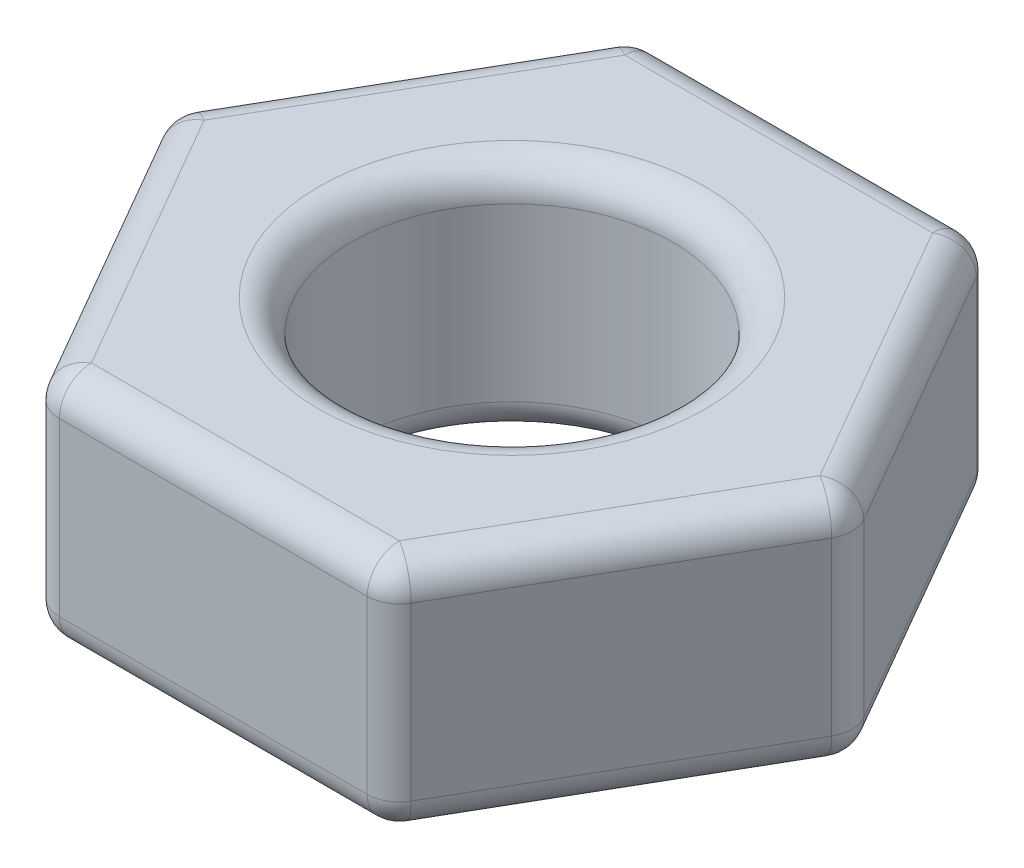
ISO-10303-21;
HEADER;
FILE_DESCRIPTION(('STEP AP214'),'2;1');
FILE_NAME('part.step','',(''),(''),'','','');
FILE_SCHEMA(('AUTOMOTIVE_DESIGN { 1 0 10303 214 1 1 1 1 }'));
ENDSEC;
DATA;
#1=APPLICATION_CONTEXT('core data for automotive mechanical design processes');
#2=APPLICATION_PROTOCOL_DEFINITION('international standard','automotive_design',2000,#1);
#3=PRODUCT_CONTEXT('',#1,'mechanical');
#4=PRODUCT('Part','Part','',(#3));
#5=PRODUCT_RELATED_PRODUCT_CATEGORY('part','',(#4));
#6=PRODUCT_DEFINITION_FORMATION('','',#4);
#7=PRODUCT_DEFINITION_CONTEXT('part definition',#1,'design');
#8=PRODUCT_DEFINITION('design','',#6,#7);
#9=PRODUCT_DEFINITION_SHAPE('','',#8);
#10=(LENGTH_UNIT() NAMED_UNIT(*) SI_UNIT(.MILLI.,.METRE.));
#11=(NAMED_UNIT(*) PLANE_ANGLE_UNIT() SI_UNIT($,.RADIAN.));
#12=(NAMED_UNIT(*) SI_UNIT($,.STERADIAN.) SOLID_ANGLE_UNIT());
#13=UNCERTAINTY_MEASURE_WITH_UNIT(LENGTH_MEASURE(1.E-05),#10,'distance_accuracy_value','');
#14=(GEOMETRIC_REPRESENTATION_CONTEXT(3) GLOBAL_UNCERTAINTY_ASSIGNED_CONTEXT((#13)) GLOBAL_UNIT_ASSIGNED_CONTEXT((#10,
#11,#12)) REPRESENTATION_CONTEXT('',''));
#15=CARTESIAN_POINT('',(0.,0.,0.));
#16=DIRECTION('',(0.,0.,1.));
#17=DIRECTION('',(1.,0.,0.));
#18=AXIS2_PLACEMENT_3D('',#15,#16,#17);
#19=CARTESIAN_POINT('',(-77.4363448327451,-39.8640445445355,42.4121777724965));
#20=DIRECTION('',(-1.,0.,0.));
#21=DIRECTION('',(0.,0.,-1.));
#22=AXIS2_PLACEMENT_3D('',#19,#20,#21);
#23=SPHERICAL_SURFACE('',#22,0.3);
#24=CARTESIAN_POINT('',(-77.4363448327451,-39.8640445445355,42.4121777724965));
#25=DIRECTION('',(0.,-1.,0.));
#26=DIRECTION('',(1.,0.,0.));
#27=AXIS2_PLACEMENT_3D('',#24,#25,#26);
#28=CIRCLE('',#27,0.299999999999995);
#29=CARTESIAN_POINT('',(-77.6961524538804,-39.8640445445355,42.2621777724965));
#30=VERTEX_POINT('',#29);
#31=CARTESIAN_POINT('',(-77.4363448327451,-39.8640445445355,42.1121777724965));
#32=VERTEX_POINT('',#31);
#33=EDGE_CURVE('E246',#30,#32,#28,.T.);
#34=ORIENTED_EDGE('',*,*,#33,.F.);
#35=CARTESIAN_POINT('',(-77.4363448327451,-39.8640445445355,42.4121777724965));
#36=DIRECTION('',(-0.5,0.,0.866025403784439));
#37=DIRECTION('',(0.866025403784439,0.,0.5));
#38=AXIS2_PLACEMENT_3D('',#35,#36,#37);
#39=CIRCLE('',#38,0.3);
#40=CARTESIAN_POINT('',(-77.4363448327451,-39.5640445445355,42.4121777724965));
#41=VERTEX_POINT('',#40);
#42=EDGE_CURVE('E242',#41,#30,#39,.T.);
#43=ORIENTED_EDGE('',*,*,#42,.F.);
#44=CARTESIAN_POINT('',(-77.4363448327451,-39.8640445445355,42.4121777724965));
#45=DIRECTION('',(-1.,0.,0.));
#46=DIRECTION('',(0.,-1.,0.));
#47=AXIS2_PLACEMENT_3D('',#44,#45,#46);
#48=CIRCLE('',#47,0.300000000000002);
#49=EDGE_CURVE('E85',#32,#41,#48,.F.);
#50=ORIENTED_EDGE('',*,*,#49,.F.);
#51=EDGE_LOOP('',(#34,#43,#50));
#52=FACE_BOUND('',#51,.T.);
#53=ADVANCED_FACE('F18',(#52),#23,.T.);
#54=CARTESIAN_POINT('',(-78.8726896654902,-39.8640445445355,44.9));
#55=DIRECTION('',(-1.,0.,0.));
#56=DIRECTION('',(0.,0.,-1.));
#57=AXIS2_PLACEMENT_3D('',#54,#55,#56);
#58=SPHERICAL_SURFACE('',#57,0.3);
#59=CARTESIAN_POINT('',(-78.8726896654902,-39.8640445445355,44.9));
#60=DIRECTION('',(0.5,0.,0.866025403784439));
#61=DIRECTION('',(0.866025403784439,0.,-0.5));
#62=AXIS2_PLACEMENT_3D('',#59,#60,#61);
#63=CIRCLE('',#62,0.300000000000006);
#64=CARTESIAN_POINT('',(-78.8726896654902,-39.5640445445355,44.9));
#65=VERTEX_POINT('',#64);
#66=CARTESIAN_POINT('',(-79.1324972866255,-39.8640445445355,45.05));
#67=VERTEX_POINT('',#66);
#68=EDGE_CURVE('E249',#65,#67,#63,.T.);
#69=ORIENTED_EDGE('',*,*,#68,.F.);
#70=CARTESIAN_POINT('',(-78.8726896654902,-39.8640445445355,44.9));
#71=DIRECTION('',(-0.5,0.,0.866025403784439));
#72=DIRECTION('',(0.866025403784439,0.,0.5));
#73=AXIS2_PLACEMENT_3D('',#70,#71,#72);
#74=CIRCLE('',#73,0.3);
#75=CARTESIAN_POINT('',(-79.1324972866255,-39.8640445445355,44.75));
#76=VERTEX_POINT('',#75);
#77=EDGE_CURVE('E245',#76,#65,#74,.F.);
#78=ORIENTED_EDGE('',*,*,#77,.F.);
#79=CARTESIAN_POINT('',(-78.8726896654902,-39.8640445445355,44.9));
#80=DIRECTION('',(0.,-1.,0.));
#81=DIRECTION('',(1.,0.,0.));
#82=AXIS2_PLACEMENT_3D('',#79,#80,#81);
#83=CIRCLE('',#82,0.299999999999995);
#84=CARTESIAN_POINT('',(-79.1726896654902,-39.8640445445355,44.9));
#85=VERTEX_POINT('',#84);
#86=EDGE_CURVE('E302',#85,#76,#83,.T.);
#87=ORIENTED_EDGE('',*,*,#86,.F.);
#88=CARTESIAN_POINT('',(-78.8726896654902,-39.8640445445355,44.9));
#89=DIRECTION('',(0.,-1.,0.));
#90=DIRECTION('',(1.,0.,0.));
#91=AXIS2_PLACEMENT_3D('',#88,#89,#90);
#92=CIRCLE('',#91,0.299999999999995);
#93=EDGE_CURVE('E252',#67,#85,#92,.T.);
#94=ORIENTED_EDGE('',*,*,#93,.F.);
#95=EDGE_LOOP('',(#69,#78,#87,#94));
#96=FACE_BOUND('',#95,.T.);
#97=ADVANCED_FACE('F306',(#96),#58,.T.);
#98=CARTESIAN_POINT('',(-77.4363448327451,-39.8640445445355,47.3878222275035));
#99=DIRECTION('',(-1.,0.,0.));
#100=DIRECTION('',(0.,0.,-1.));
#101=AXIS2_PLACEMENT_3D('',#98,#99,#100);
#102=SPHERICAL_SURFACE('',#101,0.3);
#103=CARTESIAN_POINT('',(-77.4363448327451,-39.8640445445355,47.3878222275035));
#104=DIRECTION('',(1.,0.,0.));
#105=DIRECTION('',(0.,1.,0.));
#106=AXIS2_PLACEMENT_3D('',#103,#104,#105);
#107=CIRCLE('',#106,0.300000000000002);
#108=CARTESIAN_POINT('',(-77.4363448327451,-39.5640445445355,47.3878222275035));
#109=VERTEX_POINT('',#108);
#110=CARTESIAN_POINT('',(-77.4363448327451,-39.8640445445355,47.6878222275035));
#111=VERTEX_POINT('',#110);
#112=EDGE_CURVE('E413',#109,#111,#107,.T.);
#113=ORIENTED_EDGE('',*,*,#112,.F.);
#114=CARTESIAN_POINT('',(-77.4363448327451,-39.8640445445355,47.3878222275035));
#115=DIRECTION('',(0.5,0.,0.866025403784439));
#116=DIRECTION('',(0.866025403784439,0.,-0.5));
#117=AXIS2_PLACEMENT_3D('',#114,#115,#116);
#118=CIRCLE('',#117,0.300000000000006);
#119=CARTESIAN_POINT('',(-77.6961524538804,-39.8640445445355,47.5378222275035));
#120=VERTEX_POINT('',#119);
#121=EDGE_CURVE('E251',#120,#109,#118,.F.);
#122=ORIENTED_EDGE('',*,*,#121,.F.);
#123=CARTESIAN_POINT('',(-77.4363448327451,-39.8640445445355,47.3878222275035));
#124=DIRECTION('',(0.,-1.,0.));
#125=DIRECTION('',(1.,0.,0.));
#126=AXIS2_PLACEMENT_3D('',#123,#124,#125);
#127=CIRCLE('',#126,0.299999999999995);
#128=EDGE_CURVE('E411',#111,#120,#127,.T.);
#129=ORIENTED_EDGE('',*,*,#128,.F.);
#130=EDGE_LOOP('',(#113,#122,#129));
#131=FACE_BOUND('',#130,.T.);
#132=ADVANCED_FACE('F309',(#131),#102,.T.);
#133=CARTESIAN_POINT('',(-74.5636551672549,-39.8640445445355,47.3878222275035));
#134=DIRECTION('',(-1.,0.,0.));
#135=DIRECTION('',(0.,0.,-1.));
#136=AXIS2_PLACEMENT_3D('',#133,#134,#135);
#137=SPHERICAL_SURFACE('',#136,0.3);
#138=CARTESIAN_POINT('',(-74.5636551672549,-39.8640445445355,47.3878222275035));
#139=DIRECTION('',(0.,-1.,0.));
#140=DIRECTION('',(1.,0.,0.));
#141=AXIS2_PLACEMENT_3D('',#138,#139,#140);
#142=CIRCLE('',#141,0.299999999999995);
#143=CARTESIAN_POINT('',(-74.3038475461196,-39.8640445445355,47.5378222275035));
#144=VERTEX_POINT('',#143);
#145=CARTESIAN_POINT('',(-74.5636551672549,-39.8640445445355,47.6878222275035));
#146=VERTEX_POINT('',#145);
#147=EDGE_CURVE('E321',#144,#146,#142,.T.);
#148=ORIENTED_EDGE('',*,*,#147,.F.);
#149=CARTESIAN_POINT('',(-74.5636551672549,-39.8640445445355,47.3878222275035));
#150=DIRECTION('',(0.5,0.,-0.866025403784439));
#151=DIRECTION('',(-0.866025403784439,0.,-0.5));
#152=AXIS2_PLACEMENT_3D('',#149,#150,#151);
#153=CIRCLE('',#152,0.3);
#154=CARTESIAN_POINT('',(-74.5636551672549,-39.5640445445355,47.3878222275035));
#155=VERTEX_POINT('',#154);
#156=EDGE_CURVE('E255',#155,#144,#153,.T.);
#157=ORIENTED_EDGE('',*,*,#156,.F.);
#158=CARTESIAN_POINT('',(-74.5636551672549,-39.8640445445355,47.3878222275035));
#159=DIRECTION('',(1.,0.,0.));
#160=DIRECTION('',(0.,1.,0.));
#161=AXIS2_PLACEMENT_3D('',#158,#159,#160);
#162=CIRCLE('',#161,0.300000000000002);
#163=EDGE_CURVE('E322',#146,#155,#162,.F.);
#164=ORIENTED_EDGE('',*,*,#163,.F.);
#165=EDGE_LOOP('',(#148,#157,#164));
#166=FACE_BOUND('',#165,.T.);
#167=ADVANCED_FACE('F313',(#166),#137,.T.);
#168=CARTESIAN_POINT('',(-73.1273103345099,-39.8640445445355,44.9));
#169=DIRECTION('',(-1.,0.,0.));
#170=DIRECTION('',(0.,0.,-1.));
#171=AXIS2_PLACEMENT_3D('',#168,#169,#170);
#172=SPHERICAL_SURFACE('',#171,0.3);
#173=CARTESIAN_POINT('',(-73.1273103345099,-39.8640445445355,44.9));
#174=DIRECTION('',(0.,-1.,0.));
#175=DIRECTION('',(1.,0.,0.));
#176=AXIS2_PLACEMENT_3D('',#173,#174,#175);
#177=CIRCLE('',#176,0.299999999999995);
#178=CARTESIAN_POINT('',(-72.8675027133745,-39.8640445445355,44.75));
#179=VERTEX_POINT('',#178);
#180=CARTESIAN_POINT('',(-72.8273103345099,-39.8640445445355,44.9));
#181=VERTEX_POINT('',#180);
#182=EDGE_CURVE('E38',#179,#181,#177,.T.);
#183=ORIENTED_EDGE('',*,*,#182,.F.);
#184=CARTESIAN_POINT('',(-73.1273103345098,-39.8640445445355,44.9));
#185=DIRECTION('',(-0.5,0.,-0.866025403784439));
#186=DIRECTION('',(-0.866025403784439,0.,0.5));
#187=AXIS2_PLACEMENT_3D('',#184,#185,#186);
#188=CIRCLE('',#187,0.300000000000005);
#189=CARTESIAN_POINT('',(-73.1273103345098,-39.5640445445355,44.9));
#190=VERTEX_POINT('',#189);
#191=EDGE_CURVE('E269',#190,#179,#188,.T.);
#192=ORIENTED_EDGE('',*,*,#191,.F.);
#193=CARTESIAN_POINT('',(-73.1273103345098,-39.8640445445355,44.9));
#194=DIRECTION('',(0.5,0.,-0.866025403784439));
#195=DIRECTION('',(-0.866025403784439,0.,-0.5));
#196=AXIS2_PLACEMENT_3D('',#193,#194,#195);
#197=CIRCLE('',#196,0.3);
#198=CARTESIAN_POINT('',(-72.8675027133745,-39.8640445445355,45.05));
#199=VERTEX_POINT('',#198);
#200=EDGE_CURVE('E257',#199,#190,#197,.F.);
#201=ORIENTED_EDGE('',*,*,#200,.F.);
#202=CARTESIAN_POINT('',(-73.1273103345099,-39.8640445445355,44.9));
#203=DIRECTION('',(0.,-1.,0.));
#204=DIRECTION('',(1.,0.,0.));
#205=AXIS2_PLACEMENT_3D('',#202,#203,#204);
#206=CIRCLE('',#205,0.299999999999995);
#207=EDGE_CURVE('E261',#181,#199,#206,.T.);
#208=ORIENTED_EDGE('',*,*,#207,.F.);
#209=EDGE_LOOP('',(#183,#192,#201,#208));
#210=FACE_BOUND('',#209,.T.);
#211=ADVANCED_FACE('F333',(#210),#172,.T.);
#212=CARTESIAN_POINT('',(-74.5636551672549,-39.8640445445355,42.4121777724965));
#213=DIRECTION('',(-1.,0.,0.));
#214=DIRECTION('',(0.,0.,-1.));
#215=AXIS2_PLACEMENT_3D('',#212,#213,#214);
#216=SPHERICAL_SURFACE('',#215,0.3);
#217=CARTESIAN_POINT('',(-74.5636551672549,-39.8640445445355,42.4121777724965));
#218=DIRECTION('',(0.,-1.,0.));
#219=DIRECTION('',(1.,0.,0.));
#220=AXIS2_PLACEMENT_3D('',#217,#218,#219);
#221=CIRCLE('',#220,0.299999999999995);
#222=CARTESIAN_POINT('',(-74.5636551672549,-39.8640445445355,42.1121777724965));
#223=VERTEX_POINT('',#222);
#224=CARTESIAN_POINT('',(-74.3038475461196,-39.8640445445355,42.2621777724965));
#225=VERTEX_POINT('',#224);
#226=EDGE_CURVE('E178',#223,#225,#221,.T.);
#227=ORIENTED_EDGE('',*,*,#226,.F.);
#228=CARTESIAN_POINT('',(-74.5636551672549,-39.8640445445355,42.4121777724965));
#229=DIRECTION('',(-1.,0.,0.));
#230=DIRECTION('',(0.,-1.,0.));
#231=AXIS2_PLACEMENT_3D('',#228,#229,#230);
#232=CIRCLE('',#231,0.300000000000002);
#233=CARTESIAN_POINT('',(-74.5636551672549,-39.5640445445355,42.4121777724965));
#234=VERTEX_POINT('',#233);
#235=EDGE_CURVE('E297',#234,#223,#232,.T.);
#236=ORIENTED_EDGE('',*,*,#235,.F.);
#237=CARTESIAN_POINT('',(-74.5636551672549,-39.8640445445355,42.4121777724965));
#238=DIRECTION('',(-0.5,0.,-0.866025403784439));
#239=DIRECTION('',(-0.866025403784439,0.,0.5));
#240=AXIS2_PLACEMENT_3D('',#237,#238,#239);
#241=CIRCLE('',#240,0.300000000000005);
#242=EDGE_CURVE('E265',#225,#234,#241,.F.);
#243=ORIENTED_EDGE('',*,*,#242,.F.);
#244=EDGE_LOOP('',(#227,#236,#243));
#245=FACE_BOUND('',#244,.T.);
#246=ADVANCED_FACE('F336',(#245),#216,.T.);
#247=CARTESIAN_POINT('',(-65.9999999999999,-39.5640445445355,0.));
#248=DIRECTION('',(0.,1.,0.));
#249=DIRECTION('',(-1.,0.,0.));
#250=AXIS2_PLACEMENT_3D('',#247,#248,#249);
#251=PLANE('',#250);
#252=DIRECTION('',(0.5,0.,-0.866025403784439));
#253=VECTOR('',#252,1.);
#254=CARTESIAN_POINT('',(-51.9032124359217,-39.5640445445355,8.13878409482954));
#255=LINE('',#254,#253);
#256=EDGE_CURVE('E260',#190,#155,#255,.F.);
#257=ORIENTED_EDGE('',*,*,#256,.F.);
#258=DIRECTION('',(-0.5,0.,-0.866025403784439));
#259=VECTOR('',#258,1.);
#260=CARTESIAN_POINT('',(-90.787753065843,-39.5640445445356,14.3112159051705));
#261=LINE('',#260,#259);
#262=EDGE_CURVE('E268',#234,#190,#261,.F.);
#263=ORIENTED_EDGE('',*,*,#262,.F.);
#264=DIRECTION('',(-1.,0.,0.));
#265=VECTOR('',#264,1.);
#266=CARTESIAN_POINT('',(-65.9999999999999,-39.5640445445355,42.4121777724965));
#267=LINE('',#266,#265);
#268=EDGE_CURVE('E90',#41,#234,#267,.F.);
#269=ORIENTED_EDGE('',*,*,#268,.F.);
#270=DIRECTION('',(-0.5,0.,0.866025403784439));
#271=VECTOR('',#270,1.);
#272=CARTESIAN_POINT('',(-56.2122469341569,-39.5640445445355,5.65096186732606));
#273=LINE('',#272,#271);
#274=EDGE_CURVE('E248',#65,#41,#273,.F.);
#275=ORIENTED_EDGE('',*,*,#274,.F.);
#276=DIRECTION('',(0.5,0.,0.866025403784439));
#277=VECTOR('',#276,1.);
#278=CARTESIAN_POINT('',(-95.0967875640782,-39.5640445445356,16.799038132674));
#279=LINE('',#278,#277);
#280=EDGE_CURVE('E254',#109,#65,#279,.F.);
#281=ORIENTED_EDGE('',*,*,#280,.F.);
#282=DIRECTION('',(1.,0.,0.));
#283=VECTOR('',#282,1.);
#284=CARTESIAN_POINT('',(-65.9999999999999,-39.5640445445355,47.3878222275035));
#285=LINE('',#284,#283);
#286=EDGE_CURVE('E319',#155,#109,#285,.F.);
#287=ORIENTED_EDGE('',*,*,#286,.F.);
#288=EDGE_LOOP('',(#257,#263,#269,#275,#281,#287));
#289=FACE_BOUND('',#288,.T.);
#290=CARTESIAN_POINT('',(-76.,-39.5640445445355,44.9));
#291=DIRECTION('',(0.,1.,0.));
#292=DIRECTION('',(1.,0.,0.));
#293=AXIS2_PLACEMENT_3D('',#290,#291,#292);
#294=CIRCLE('',#293,1.8);
#295=CARTESIAN_POINT('',(-74.2,-39.5640445445355,44.9));
#296=VERTEX_POINT('',#295);
#297=CARTESIAN_POINT('',(-77.8,-39.5640445445355,44.9));
#298=VERTEX_POINT('',#297);
#299=EDGE_CURVE('E108',#296,#298,#294,.T.);
#300=ORIENTED_EDGE('',*,*,#299,.F.);
#301=CARTESIAN_POINT('',(-76.,-39.5640445445355,44.9));
#302=DIRECTION('',(0.,1.,0.));
#303=DIRECTION('',(-1.,0.,0.));
#304=AXIS2_PLACEMENT_3D('',#301,#302,#303);
#305=CIRCLE('',#304,1.8);
#306=EDGE_CURVE('E362',#298,#296,#305,.T.);
#307=ORIENTED_EDGE('',*,*,#306,.F.);
#308=EDGE_LOOP('',(#300,#307));
#309=FACE_BOUND('',#308,.T.);
#310=ADVANCED_FACE('F339',(#289,#309),#251,.T.);
#311=CARTESIAN_POINT('',(-65.9999999999999,-39.8640445445355,42.4121777724965));
#312=DIRECTION('',(-1.,0.,0.));
#313=DIRECTION('',(0.,-1.,0.));
#314=AXIS2_PLACEMENT_3D('',#311,#312,#313);
#315=CYLINDRICAL_SURFACE('',#314,0.300000000000002);
#316=ORIENTED_EDGE('',*,*,#235,.T.);
#317=DIRECTION('',(1.,0.,0.));
#318=VECTOR('',#317,1.);
#319=CARTESIAN_POINT('',(-77.609549913502,-39.8640445445355,42.1121777724965));
#320=LINE('',#319,#318);
#321=EDGE_CURVE('E451',#223,#32,#320,.F.);
#322=ORIENTED_EDGE('',*,*,#321,.T.);
#323=ORIENTED_EDGE('',*,*,#49,.T.);
#324=ORIENTED_EDGE('',*,*,#268,.T.);
#325=EDGE_LOOP('',(#316,#322,#323,#324));
#326=FACE_BOUND('',#325,.T.);
#327=ADVANCED_FACE('F344',(#326),#315,.T.);
#328=CARTESIAN_POINT('',(-77.4363448327451,-39.5640445445355,42.4121777724965));
#329=DIRECTION('',(0.,-1.,0.));
#330=DIRECTION('',(1.,0.,0.));
#331=AXIS2_PLACEMENT_3D('',#328,#329,#330);
#332=CYLINDRICAL_SURFACE('',#331,0.299999999999995);
#333=CARTESIAN_POINT('',(-77.4363448327451,-41.4640445445355,42.4121777724965));
#334=DIRECTION('',(0.,-1.,0.));
#335=DIRECTION('',(-1.,0.,0.));
#336=AXIS2_PLACEMENT_3D('',#333,#334,#335);
#337=CIRCLE('',#336,0.3);
#338=CARTESIAN_POINT('',(-77.6961524538804,-41.4640445445355,42.2621777724965));
#339=VERTEX_POINT('',#338);
#340=CARTESIAN_POINT('',(-77.4363448327451,-41.4640445445355,42.1121777724965));
#341=VERTEX_POINT('',#340);
#342=EDGE_CURVE('E185',#339,#341,#337,.T.);
#343=ORIENTED_EDGE('',*,*,#342,.F.);
#344=DIRECTION('',(0.,1.,0.));
#345=VECTOR('',#344,1.);
#346=CARTESIAN_POINT('',(-77.6961524538804,-39.5640445445355,42.2621777724965));
#347=LINE('',#346,#345);
#348=EDGE_CURVE('E447',#339,#30,#347,.T.);
#349=ORIENTED_EDGE('',*,*,#348,.T.);
#350=ORIENTED_EDGE('',*,*,#33,.T.);
#351=DIRECTION('',(0.,-1.,0.));
#352=VECTOR('',#351,1.);
#353=CARTESIAN_POINT('',(-77.4363448327451,-39.5640445445355,42.1121777724965));
#354=LINE('',#353,#352);
#355=EDGE_CURVE('E461',#32,#341,#354,.T.);
#356=ORIENTED_EDGE('',*,*,#355,.T.);
#357=EDGE_LOOP('',(#343,#349,#350,#356));
#358=FACE_BOUND('',#357,.T.);
#359=ADVANCED_FACE('F613',(#358),#332,.T.);
#360=CARTESIAN_POINT('',(-56.212246934157,-39.8640445445355,5.65096186732606));
#361=DIRECTION('',(-0.5,0.,0.866025403784439));
#362=DIRECTION('',(0.866025403784439,0.,0.5));
#363=AXIS2_PLACEMENT_3D('',#360,#361,#362);
#364=CYLINDRICAL_SURFACE('',#363,0.3);
#365=ORIENTED_EDGE('',*,*,#77,.T.);
#366=ORIENTED_EDGE('',*,*,#274,.T.);
#367=ORIENTED_EDGE('',*,*,#42,.T.);
#368=DIRECTION('',(0.5,0.,-0.866025403784439));
#369=VECTOR('',#368,1.);
#370=CARTESIAN_POINT('',(-79.2190998270039,-39.8640445445355,44.9));
#371=LINE('',#370,#369);
#372=EDGE_CURVE('E443',#30,#76,#371,.F.);
#373=ORIENTED_EDGE('',*,*,#372,.T.);
#374=EDGE_LOOP('',(#365,#366,#367,#373));
#375=FACE_BOUND('',#374,.T.);
#376=ADVANCED_FACE('F610',(#375),#364,.T.);
#377=CARTESIAN_POINT('',(-78.8726896654902,-39.5640445445355,44.9));
#378=DIRECTION('',(0.,-1.,0.));
#379=DIRECTION('',(1.,0.,0.));
#380=AXIS2_PLACEMENT_3D('',#377,#378,#379);
#381=CYLINDRICAL_SURFACE('',#380,0.299999999999995);
#382=CARTESIAN_POINT('',(-78.8726896654902,-41.4640445445355,44.9));
#383=DIRECTION('',(0.,1.,0.));
#384=DIRECTION('',(-1.,0.,0.));
#385=AXIS2_PLACEMENT_3D('',#382,#383,#384);
#386=CIRCLE('',#385,0.3);
#387=CARTESIAN_POINT('',(-79.1324972866255,-41.4640445445355,45.05));
#388=VERTEX_POINT('',#387);
#389=CARTESIAN_POINT('',(-79.1726896654902,-41.4640445445355,44.9));
#390=VERTEX_POINT('',#389);
#391=EDGE_CURVE('E502',#388,#390,#386,.F.);
#392=ORIENTED_EDGE('',*,*,#391,.F.);
#393=DIRECTION('',(0.,1.,0.));
#394=VECTOR('',#393,1.);
#395=CARTESIAN_POINT('',(-79.1324972866255,-39.5640445445355,45.05));
#396=LINE('',#395,#394);
#397=EDGE_CURVE('E432',#388,#67,#396,.T.);
#398=ORIENTED_EDGE('',*,*,#397,.T.);
#399=ORIENTED_EDGE('',*,*,#93,.T.);
#400=ORIENTED_EDGE('',*,*,#86,.T.);
#401=DIRECTION('',(0.,1.,0.));
#402=VECTOR('',#401,1.);
#403=CARTESIAN_POINT('',(-79.1324972866255,-39.5640445445355,44.75));
#404=LINE('',#403,#402);
#405=CARTESIAN_POINT('',(-79.1324972866255,-41.4640445445355,44.75));
#406=VERTEX_POINT('',#405);
#407=EDGE_CURVE('E446',#76,#406,#404,.F.);
#408=ORIENTED_EDGE('',*,*,#407,.T.);
#409=CARTESIAN_POINT('',(-78.8726896654902,-41.4640445445355,44.9));
#410=DIRECTION('',(0.,-1.,0.));
#411=DIRECTION('',(1.,0.,0.));
#412=AXIS2_PLACEMENT_3D('',#409,#410,#411);
#413=CIRCLE('',#412,0.299999999999995);
#414=EDGE_CURVE('E434',#406,#390,#413,.F.);
#415=ORIENTED_EDGE('',*,*,#414,.T.);
#416=EDGE_LOOP('',(#392,#398,#399,#400,#408,#415));
#417=FACE_BOUND('',#416,.T.);
#418=ADVANCED_FACE('F518',(#417),#381,.T.);
#419=CARTESIAN_POINT('',(-95.0967875640782,-39.8640445445356,16.799038132674));
#420=DIRECTION('',(0.5,0.,0.866025403784439));
#421=DIRECTION('',(0.866025403784439,0.,-0.5));
#422=AXIS2_PLACEMENT_3D('',#419,#420,#421);
#423=CYLINDRICAL_SURFACE('',#422,0.300000000000006);
#424=ORIENTED_EDGE('',*,*,#121,.T.);
#425=ORIENTED_EDGE('',*,*,#280,.T.);
#426=ORIENTED_EDGE('',*,*,#68,.T.);
#427=DIRECTION('',(-0.5,0.,-0.866025403784439));
#428=VECTOR('',#427,1.);
#429=CARTESIAN_POINT('',(-77.609549913502,-39.8640445445355,47.6878222275035));
#430=LINE('',#429,#428);
#431=EDGE_CURVE('E428',#67,#120,#430,.F.);
#432=ORIENTED_EDGE('',*,*,#431,.T.);
#433=EDGE_LOOP('',(#424,#425,#426,#432));
#434=FACE_BOUND('',#433,.T.);
#435=ADVANCED_FACE('F889',(#434),#423,.T.);
#436=CARTESIAN_POINT('',(-77.4363448327451,-39.5640445445355,47.3878222275035));
#437=DIRECTION('',(0.,-1.,0.));
#438=DIRECTION('',(1.,0.,0.));
#439=AXIS2_PLACEMENT_3D('',#436,#437,#438);
#440=CYLINDRICAL_SURFACE('',#439,0.299999999999995);
#441=CARTESIAN_POINT('',(-77.4363448327451,-41.4640445445355,47.3878222275035));
#442=DIRECTION('',(0.,1.,0.));
#443=DIRECTION('',(-1.,0.,0.));
#444=AXIS2_PLACEMENT_3D('',#441,#442,#443);
#445=CIRCLE('',#444,0.3);
#446=CARTESIAN_POINT('',(-77.4363448327451,-41.4640445445355,47.6878222275035));
#447=VERTEX_POINT('',#446);
#448=CARTESIAN_POINT('',(-77.6961524538804,-41.4640445445355,47.5378222275035));
#449=VERTEX_POINT('',#448);
#450=EDGE_CURVE('E575',#447,#449,#445,.F.);
#451=ORIENTED_EDGE('',*,*,#450,.F.);
#452=DIRECTION('',(0.,1.,0.));
#453=VECTOR('',#452,1.);
#454=CARTESIAN_POINT('',(-77.4363448327451,-39.5640445445355,47.6878222275035));
#455=LINE('',#454,#453);
#456=EDGE_CURVE('E419',#447,#111,#455,.T.);
#457=ORIENTED_EDGE('',*,*,#456,.T.);
#458=ORIENTED_EDGE('',*,*,#128,.T.);
#459=DIRECTION('',(0.,1.,0.));
#460=VECTOR('',#459,1.);
#461=CARTESIAN_POINT('',(-77.6961524538804,-39.5640445445355,47.5378222275035));
#462=LINE('',#461,#460);
#463=EDGE_CURVE('E431',#120,#449,#462,.F.);
#464=ORIENTED_EDGE('',*,*,#463,.T.);
#465=EDGE_LOOP('',(#451,#457,#458,#464));
#466=FACE_BOUND('',#465,.T.);
#467=ADVANCED_FACE('F595',(#466),#440,.T.);
#468=CARTESIAN_POINT('',(-65.9999999999999,-39.8640445445355,47.3878222275035));
#469=DIRECTION('',(1.,0.,0.));
#470=DIRECTION('',(0.,1.,0.));
#471=AXIS2_PLACEMENT_3D('',#468,#469,#470);
#472=CYLINDRICAL_SURFACE('',#471,0.300000000000002);
#473=ORIENTED_EDGE('',*,*,#163,.T.);
#474=ORIENTED_EDGE('',*,*,#286,.T.);
#475=ORIENTED_EDGE('',*,*,#112,.T.);
#476=DIRECTION('',(1.,0.,0.));
#477=VECTOR('',#476,1.);
#478=CARTESIAN_POINT('',(-74.390450086498,-39.8640445445355,47.6878222275035));
#479=LINE('',#478,#477);
#480=EDGE_CURVE('E416',#111,#146,#479,.T.);
#481=ORIENTED_EDGE('',*,*,#480,.T.);
#482=EDGE_LOOP('',(#473,#474,#475,#481));
#483=FACE_BOUND('',#482,.T.);
#484=ADVANCED_FACE('F871',(#483),#472,.T.);
#485=CARTESIAN_POINT('',(-74.5636551672549,-39.5640445445355,47.3878222275035));
#486=DIRECTION('',(0.,-1.,0.));
#487=DIRECTION('',(1.,0.,0.));
#488=AXIS2_PLACEMENT_3D('',#485,#486,#487);
#489=CYLINDRICAL_SURFACE('',#488,0.299999999999995);
#490=CARTESIAN_POINT('',(-74.5636551672549,-41.4640445445355,47.3878222275035));
#491=DIRECTION('',(0.,-1.,0.));
#492=DIRECTION('',(1.,0.,0.));
#493=AXIS2_PLACEMENT_3D('',#490,#491,#492);
#494=CIRCLE('',#493,0.299999999999995);
#495=CARTESIAN_POINT('',(-74.5636551672549,-41.4640445445355,47.6878222275035));
#496=VERTEX_POINT('',#495);
#497=CARTESIAN_POINT('',(-74.3038475461196,-41.4640445445355,47.5378222275035));
#498=VERTEX_POINT('',#497);
#499=EDGE_CURVE('E258',#496,#498,#494,.F.);
#500=ORIENTED_EDGE('',*,*,#499,.T.);
#501=DIRECTION('',(0.,1.,0.));
#502=VECTOR('',#501,1.);
#503=CARTESIAN_POINT('',(-74.3038475461196,-39.5640445445355,47.5378222275035));
#504=LINE('',#503,#502);
#505=EDGE_CURVE('E404',#498,#144,#504,.T.);
#506=ORIENTED_EDGE('',*,*,#505,.T.);
#507=ORIENTED_EDGE('',*,*,#147,.T.);
#508=DIRECTION('',(0.,1.,0.));
#509=VECTOR('',#508,1.);
#510=CARTESIAN_POINT('',(-74.5636551672549,-39.5640445445355,47.6878222275035));
#511=LINE('',#510,#509);
#512=EDGE_CURVE('E577',#146,#496,#511,.F.);
#513=ORIENTED_EDGE('',*,*,#512,.T.);
#514=EDGE_LOOP('',(#500,#506,#507,#513));
#515=FACE_BOUND('',#514,.T.);
#516=ADVANCED_FACE('F647',(#515),#489,.T.);
#517=CARTESIAN_POINT('',(-51.9032124359217,-39.8640445445355,8.13878409482955));
#518=DIRECTION('',(0.5,0.,-0.866025403784439));
#519=DIRECTION('',(-0.866025403784439,0.,-0.5));
#520=AXIS2_PLACEMENT_3D('',#517,#518,#519);
#521=CYLINDRICAL_SURFACE('',#520,0.3);
#522=ORIENTED_EDGE('',*,*,#200,.T.);
#523=ORIENTED_EDGE('',*,*,#256,.T.);
#524=ORIENTED_EDGE('',*,*,#156,.T.);
#525=DIRECTION('',(-0.5,0.,0.866025403784439));
#526=VECTOR('',#525,1.);
#527=CARTESIAN_POINT('',(-72.7809001729961,-39.8640445445355,44.9));
#528=LINE('',#527,#526);
#529=EDGE_CURVE('E400',#144,#199,#528,.F.);
#530=ORIENTED_EDGE('',*,*,#529,.T.);
#531=EDGE_LOOP('',(#522,#523,#524,#530));
#532=FACE_BOUND('',#531,.T.);
#533=ADVANCED_FACE('F638',(#532),#521,.T.);
#534=CARTESIAN_POINT('',(-73.1273103345099,-39.5640445445355,44.9));
#535=DIRECTION('',(0.,-1.,0.));
#536=DIRECTION('',(1.,0.,0.));
#537=AXIS2_PLACEMENT_3D('',#534,#535,#536);
#538=CYLINDRICAL_SURFACE('',#537,0.299999999999995);
#539=CARTESIAN_POINT('',(-73.1273103345099,-41.4640445445355,44.9));
#540=DIRECTION('',(0.,-1.,0.));
#541=DIRECTION('',(1.,0.,0.));
#542=AXIS2_PLACEMENT_3D('',#539,#540,#541);
#543=CIRCLE('',#542,0.299999999999995);
#544=CARTESIAN_POINT('',(-72.8273103345099,-41.4640445445355,44.9));
#545=VERTEX_POINT('',#544);
#546=CARTESIAN_POINT('',(-72.8675027133745,-41.4640445445355,44.75));
#547=VERTEX_POINT('',#546);
#548=EDGE_CURVE('E263',#545,#547,#543,.F.);
#549=ORIENTED_EDGE('',*,*,#548,.T.);
#550=DIRECTION('',(0.,1.,0.));
#551=VECTOR('',#550,1.);
#552=CARTESIAN_POINT('',(-72.8675027133745,-39.5640445445355,44.75));
#553=LINE('',#552,#551);
#554=EDGE_CURVE('E397',#547,#179,#553,.T.);
#555=ORIENTED_EDGE('',*,*,#554,.T.);
#556=ORIENTED_EDGE('',*,*,#182,.T.);
#557=ORIENTED_EDGE('',*,*,#207,.T.);
#558=DIRECTION('',(0.,1.,0.));
#559=VECTOR('',#558,1.);
#560=CARTESIAN_POINT('',(-72.8675027133745,-39.5640445445355,45.05));
#561=LINE('',#560,#559);
#562=CARTESIAN_POINT('',(-72.8675027133745,-41.4640445445355,45.05));
#563=VERTEX_POINT('',#562);
#564=EDGE_CURVE('E403',#199,#563,#561,.F.);
#565=ORIENTED_EDGE('',*,*,#564,.T.);
#566=CARTESIAN_POINT('',(-73.1273103345099,-41.4640445445355,44.9));
#567=DIRECTION('',(0.,-1.,0.));
#568=DIRECTION('',(1.,0.,0.));
#569=AXIS2_PLACEMENT_3D('',#566,#567,#568);
#570=CIRCLE('',#569,0.299999999999995);
#571=EDGE_CURVE('E100',#563,#545,#570,.F.);
#572=ORIENTED_EDGE('',*,*,#571,.T.);
#573=EDGE_LOOP('',(#549,#555,#556,#557,#565,#572));
#574=FACE_BOUND('',#573,.T.);
#575=ADVANCED_FACE('F847',(#574),#538,.T.);
#576=CARTESIAN_POINT('',(-90.787753065843,-39.8640445445356,14.3112159051705));
#577=DIRECTION('',(-0.5,0.,-0.866025403784439));
#578=DIRECTION('',(-0.866025403784439,0.,0.5));
#579=AXIS2_PLACEMENT_3D('',#576,#577,#578);
#580=CYLINDRICAL_SURFACE('',#579,0.300000000000005);
#581=ORIENTED_EDGE('',*,*,#191,.T.);
#582=DIRECTION('',(0.5,0.,0.866025403784439));
#583=VECTOR('',#582,1.);
#584=CARTESIAN_POINT('',(-74.390450086498,-39.8640445445355,42.1121777724965));
#585=LINE('',#584,#583);
#586=EDGE_CURVE('E394',#179,#225,#585,.F.);
#587=ORIENTED_EDGE('',*,*,#586,.T.);
#588=ORIENTED_EDGE('',*,*,#242,.T.);
#589=ORIENTED_EDGE('',*,*,#262,.T.);
#590=EDGE_LOOP('',(#581,#587,#588,#589));
#591=FACE_BOUND('',#590,.T.);
#592=ADVANCED_FACE('F626',(#591),#580,.T.);
#593=CARTESIAN_POINT('',(-74.5636551672549,-39.5640445445355,42.4121777724965));
#594=DIRECTION('',(0.,-1.,0.));
#595=DIRECTION('',(1.,0.,0.));
#596=AXIS2_PLACEMENT_3D('',#593,#594,#595);
#597=CYLINDRICAL_SURFACE('',#596,0.299999999999995);
#598=CARTESIAN_POINT('',(-74.5636551672549,-41.4640445445355,42.4121777724965));
#599=DIRECTION('',(0.,-1.,0.));
#600=DIRECTION('',(-1.,0.,0.));
#601=AXIS2_PLACEMENT_3D('',#598,#599,#600);
#602=CIRCLE('',#601,0.3);
#603=CARTESIAN_POINT('',(-74.5636551672549,-41.4640445445355,42.1121777724965));
#604=VERTEX_POINT('',#603);
#605=CARTESIAN_POINT('',(-74.3038475461196,-41.4640445445355,42.2621777724965));
#606=VERTEX_POINT('',#605);
#607=EDGE_CURVE('E636',#604,#606,#602,.T.);
#608=ORIENTED_EDGE('',*,*,#607,.F.);
#609=DIRECTION('',(0.,-1.,0.));
#610=VECTOR('',#609,1.);
#611=CARTESIAN_POINT('',(-74.5636551672549,-39.5640445445355,42.1121777724965));
#612=LINE('',#611,#610);
#613=EDGE_CURVE('E191',#604,#223,#612,.F.);
#614=ORIENTED_EDGE('',*,*,#613,.T.);
#615=ORIENTED_EDGE('',*,*,#226,.T.);
#616=DIRECTION('',(0.,1.,0.));
#617=VECTOR('',#616,1.);
#618=CARTESIAN_POINT('',(-74.3038475461196,-39.5640445445355,42.2621777724965));
#619=LINE('',#618,#617);
#620=EDGE_CURVE('E390',#225,#606,#619,.F.);
#621=ORIENTED_EDGE('',*,*,#620,.T.);
#622=EDGE_LOOP('',(#608,#614,#615,#621));
#623=FACE_BOUND('',#622,.T.);
#624=ADVANCED_FACE('F377',(#623),#597,.T.);
#625=CARTESIAN_POINT('',(-76.,-39.8640445445355,44.9));
#626=DIRECTION('',(0.,1.,0.));
#627=DIRECTION('',(1.,0.,0.));
#628=AXIS2_PLACEMENT_3D('',#625,#626,#627);
#629=TOROIDAL_SURFACE('',#628,1.8,0.3);
#630=ORIENTED_EDGE('',*,*,#299,.T.);
#631=ORIENTED_EDGE('',*,*,#306,.T.);
#632=EDGE_LOOP('',(#630,#631));
#633=FACE_BOUND('',#632,.T.);
#634=CARTESIAN_POINT('',(-76.,-39.8640445445355,44.9));
#635=DIRECTION('',(0.,-1.,0.));
#636=DIRECTION('',(1.,0.,0.));
#637=AXIS2_PLACEMENT_3D('',#634,#635,#636);
#638=CIRCLE('',#637,1.5);
#639=CARTESIAN_POINT('',(-74.5,-39.8640445445355,44.9));
#640=VERTEX_POINT('',#639);
#641=EDGE_CURVE('E386',#640,#640,#638,.T.);
#642=ORIENTED_EDGE('',*,*,#641,.T.);
#643=EDGE_LOOP('',(#642));
#644=FACE_BOUND('',#643,.T.);
#645=ADVANCED_FACE('F365',(#633,#644),#629,.T.);
#646=CARTESIAN_POINT('',(-77.609549913502,-39.5640445445355,42.1121777724965));
#647=DIRECTION('',(0.,0.,1.));
#648=DIRECTION('',(0.,-1.,0.));
#649=AXIS2_PLACEMENT_3D('',#646,#647,#648);
#650=PLANE('',#649);
#651=ORIENTED_EDGE('',*,*,#613,.F.);
#652=DIRECTION('',(1.,0.,0.));
#653=VECTOR('',#652,1.);
#654=CARTESIAN_POINT('',(-77.609549913502,-41.4640445445355,42.1121777724965));
#655=LINE('',#654,#653);
#656=EDGE_CURVE('E471',#341,#604,#655,.T.);
#657=ORIENTED_EDGE('',*,*,#656,.F.);
#658=ORIENTED_EDGE('',*,*,#355,.F.);
#659=ORIENTED_EDGE('',*,*,#321,.F.);
#660=EDGE_LOOP('',(#651,#657,#658,#659));
#661=FACE_BOUND('',#660,.T.);
#662=ADVANCED_FACE('F376',(#661),#650,.F.);
#663=CARTESIAN_POINT('',(-77.4363448327451,-41.4640445445355,42.4121777724965));
#664=DIRECTION('',(-1.,0.,0.));
#665=DIRECTION('',(0.,0.,-1.));
#666=AXIS2_PLACEMENT_3D('',#663,#664,#665);
#667=SPHERICAL_SURFACE('',#666,0.3);
#668=CARTESIAN_POINT('',(-77.4363448327451,-41.4640445445355,42.4121777724965));
#669=DIRECTION('',(1.,0.,0.));
#670=DIRECTION('',(0.,1.,0.));
#671=AXIS2_PLACEMENT_3D('',#668,#669,#670);
#672=CIRCLE('',#671,0.300000000000002);
#673=CARTESIAN_POINT('',(-77.4363448327451,-41.7640445445355,42.4121777724965));
#674=VERTEX_POINT('',#673);
#675=EDGE_CURVE('E389',#674,#341,#672,.T.);
#676=ORIENTED_EDGE('',*,*,#675,.F.);
#677=CARTESIAN_POINT('',(-77.4363448327451,-41.4640445445355,42.4121777724965));
#678=DIRECTION('',(0.5,0.,-0.866025403784439));
#679=DIRECTION('',(-0.866025403784439,0.,-0.5));
#680=AXIS2_PLACEMENT_3D('',#677,#678,#679);
#681=CIRCLE('',#680,0.300000000000005);
#682=EDGE_CURVE('E271',#339,#674,#681,.F.);
#683=ORIENTED_EDGE('',*,*,#682,.F.);
#684=ORIENTED_EDGE('',*,*,#342,.T.);
#685=EDGE_LOOP('',(#676,#683,#684));
#686=FACE_BOUND('',#685,.T.);
#687=ADVANCED_FACE('F484',(#686),#667,.T.);
#688=CARTESIAN_POINT('',(-79.2190998270039,-39.5640445445355,44.9));
#689=DIRECTION('',(0.866025403784439,0.,0.5));
#690=DIRECTION('',(0.5,0.,-0.866025403784439));
#691=AXIS2_PLACEMENT_3D('',#688,#689,#690);
#692=PLANE('',#691);
#693=ORIENTED_EDGE('',*,*,#372,.F.);
#694=ORIENTED_EDGE('',*,*,#348,.F.);
#695=DIRECTION('',(0.5,0.,-0.866025403784439));
#696=VECTOR('',#695,1.);
#697=CARTESIAN_POINT('',(-79.219099827004,-41.4640445445355,44.9));
#698=LINE('',#697,#696);
#699=EDGE_CURVE('E277',#406,#339,#698,.T.);
#700=ORIENTED_EDGE('',*,*,#699,.F.);
#701=ORIENTED_EDGE('',*,*,#407,.F.);
#702=EDGE_LOOP('',(#693,#694,#700,#701));
#703=FACE_BOUND('',#702,.T.);
#704=ADVANCED_FACE('F487',(#703),#692,.F.);
#705=CARTESIAN_POINT('',(-78.8726896654902,-41.4640445445355,44.9));
#706=DIRECTION('',(-1.,0.,0.));
#707=DIRECTION('',(0.,0.,-1.));
#708=AXIS2_PLACEMENT_3D('',#705,#706,#707);
#709=SPHERICAL_SURFACE('',#708,0.3);
#710=ORIENTED_EDGE('',*,*,#391,.T.);
#711=ORIENTED_EDGE('',*,*,#414,.F.);
#712=CARTESIAN_POINT('',(-78.8726896654902,-41.4640445445355,44.9));
#713=DIRECTION('',(0.5,0.,-0.866025403784439));
#714=DIRECTION('',(-0.866025403784439,0.,-0.5));
#715=AXIS2_PLACEMENT_3D('',#712,#713,#714);
#716=CIRCLE('',#715,0.300000000000005);
#717=CARTESIAN_POINT('',(-78.8726896654902,-41.7640445445355,44.9));
#718=VERTEX_POINT('',#717);
#719=EDGE_CURVE('E273',#718,#406,#716,.T.);
#720=ORIENTED_EDGE('',*,*,#719,.F.);
#721=CARTESIAN_POINT('',(-78.8726896654902,-41.4640445445355,44.9));
#722=DIRECTION('',(-0.5,0.,-0.866025403784439));
#723=DIRECTION('',(-0.866025403784439,0.,0.5));
#724=AXIS2_PLACEMENT_3D('',#721,#722,#723);
#725=CIRCLE('',#724,0.300000000000005);
#726=EDGE_CURVE('E278',#388,#718,#725,.F.);
#727=ORIENTED_EDGE('',*,*,#726,.F.);
#728=EDGE_LOOP('',(#710,#711,#720,#727));
#729=FACE_BOUND('',#728,.T.);
#730=ADVANCED_FACE('F490',(#729),#709,.T.);
#731=CARTESIAN_POINT('',(-77.609549913502,-39.5640445445355,47.6878222275035));
#732=DIRECTION('',(0.866025403784439,0.,-0.5));
#733=DIRECTION('',(-0.5,0.,-0.866025403784439));
#734=AXIS2_PLACEMENT_3D('',#731,#732,#733);
#735=PLANE('',#734);
#736=ORIENTED_EDGE('',*,*,#431,.F.);
#737=ORIENTED_EDGE('',*,*,#397,.F.);
#738=DIRECTION('',(-0.5,0.,-0.866025403784439));
#739=VECTOR('',#738,1.);
#740=CARTESIAN_POINT('',(-77.609549913502,-41.4640445445355,47.6878222275035));
#741=LINE('',#740,#739);
#742=EDGE_CURVE('E283',#449,#388,#741,.T.);
#743=ORIENTED_EDGE('',*,*,#742,.F.);
#744=ORIENTED_EDGE('',*,*,#463,.F.);
#745=EDGE_LOOP('',(#736,#737,#743,#744));
#746=FACE_BOUND('',#745,.T.);
#747=ADVANCED_FACE('F495',(#746),#735,.F.);
#748=CARTESIAN_POINT('',(-77.4363448327451,-41.4640445445355,47.3878222275035));
#749=DIRECTION('',(-1.,0.,0.));
#750=DIRECTION('',(0.,0.,-1.));
#751=AXIS2_PLACEMENT_3D('',#748,#749,#750);
#752=SPHERICAL_SURFACE('',#751,0.3);
#753=CARTESIAN_POINT('',(-77.4363448327451,-41.4640445445355,47.3878222275035));
#754=DIRECTION('',(-1.,0.,0.));
#755=DIRECTION('',(0.,-1.,0.));
#756=AXIS2_PLACEMENT_3D('',#753,#754,#755);
#757=CIRCLE('',#756,0.300000000000002);
#758=CARTESIAN_POINT('',(-77.4363448327451,-41.7640445445355,47.3878222275035));
#759=VERTEX_POINT('',#758);
#760=EDGE_CURVE('E580',#447,#759,#757,.F.);
#761=ORIENTED_EDGE('',*,*,#760,.F.);
#762=ORIENTED_EDGE('',*,*,#450,.T.);
#763=CARTESIAN_POINT('',(-77.4363448327451,-41.4640445445355,47.3878222275035));
#764=DIRECTION('',(-0.5,0.,-0.866025403784439));
#765=DIRECTION('',(-0.866025403784439,0.,0.5));
#766=AXIS2_PLACEMENT_3D('',#763,#764,#765);
#767=CIRCLE('',#766,0.300000000000005);
#768=EDGE_CURVE('E280',#759,#449,#767,.T.);
#769=ORIENTED_EDGE('',*,*,#768,.F.);
#770=EDGE_LOOP('',(#761,#762,#769));
#771=FACE_BOUND('',#770,.T.);
#772=ADVANCED_FACE('F565',(#771),#752,.T.);
#773=CARTESIAN_POINT('',(-74.390450086498,-39.5640445445355,47.6878222275035));
#774=DIRECTION('',(0.,0.,-1.));
#775=DIRECTION('',(0.,1.,0.));
#776=AXIS2_PLACEMENT_3D('',#773,#774,#775);
#777=PLANE('',#776);
#778=ORIENTED_EDGE('',*,*,#456,.F.);
#779=DIRECTION('',(-1.,0.,0.));
#780=VECTOR('',#779,1.);
#781=CARTESIAN_POINT('',(-74.390450086498,-41.4640445445355,47.6878222275035));
#782=LINE('',#781,#780);
#783=EDGE_CURVE('E288',#496,#447,#782,.T.);
#784=ORIENTED_EDGE('',*,*,#783,.F.);
#785=ORIENTED_EDGE('',*,*,#512,.F.);
#786=ORIENTED_EDGE('',*,*,#480,.F.);
#787=EDGE_LOOP('',(#778,#784,#785,#786));
#788=FACE_BOUND('',#787,.T.);
#789=ADVANCED_FACE('F562',(#788),#777,.F.);
#790=CARTESIAN_POINT('',(-72.7809001729961,-39.5640445445355,44.9));
#791=DIRECTION('',(-0.866025403784439,0.,-0.5));
#792=DIRECTION('',(-0.5,0.,0.866025403784439));
#793=AXIS2_PLACEMENT_3D('',#790,#791,#792);
#794=PLANE('',#793);
#795=ORIENTED_EDGE('',*,*,#529,.F.);
#796=ORIENTED_EDGE('',*,*,#505,.F.);
#797=DIRECTION('',(-0.5,0.,0.866025403784439));
#798=VECTOR('',#797,1.);
#799=CARTESIAN_POINT('',(-72.7809001729961,-41.4640445445355,44.9));
#800=LINE('',#799,#798);
#801=EDGE_CURVE('E287',#563,#498,#800,.T.);
#802=ORIENTED_EDGE('',*,*,#801,.F.);
#803=ORIENTED_EDGE('',*,*,#564,.F.);
#804=EDGE_LOOP('',(#795,#796,#802,#803));
#805=FACE_BOUND('',#804,.T.);
#806=ADVANCED_FACE('F556',(#805),#794,.F.);
#807=CARTESIAN_POINT('',(-74.5636551672549,-41.4640445445355,47.3878222275035));
#808=DIRECTION('',(-1.,0.,0.));
#809=DIRECTION('',(0.,0.,-1.));
#810=AXIS2_PLACEMENT_3D('',#807,#808,#809);
#811=SPHERICAL_SURFACE('',#810,0.3);
#812=CARTESIAN_POINT('',(-74.5636551672549,-41.4640445445355,47.3878222275035));
#813=DIRECTION('',(-0.5,0.,0.866025403784439));
#814=DIRECTION('',(0.866025403784439,0.,0.5));
#815=AXIS2_PLACEMENT_3D('',#812,#813,#814);
#816=CIRCLE('',#815,0.300000000000005);
#817=CARTESIAN_POINT('',(-74.5636551672549,-41.7640445445355,47.3878222275035));
#818=VERTEX_POINT('',#817);
#819=EDGE_CURVE('E289',#498,#818,#816,.F.);
#820=ORIENTED_EDGE('',*,*,#819,.F.);
#821=ORIENTED_EDGE('',*,*,#499,.F.);
#822=CARTESIAN_POINT('',(-74.5636551672549,-41.4640445445355,47.3878222275035));
#823=DIRECTION('',(-1.,0.,0.));
#824=DIRECTION('',(0.,-1.,0.));
#825=AXIS2_PLACEMENT_3D('',#822,#823,#824);
#826=CIRCLE('',#825,0.300000000000002);
#827=EDGE_CURVE('E582',#818,#496,#826,.T.);
#828=ORIENTED_EDGE('',*,*,#827,.F.);
#829=EDGE_LOOP('',(#820,#821,#828));
#830=FACE_BOUND('',#829,.T.);
#831=ADVANCED_FACE('F551',(#830),#811,.T.);
#832=CARTESIAN_POINT('',(-74.5636551672549,-41.4640445445355,42.4121777724965));
#833=DIRECTION('',(-1.,0.,0.));
#834=DIRECTION('',(0.,0.,-1.));
#835=AXIS2_PLACEMENT_3D('',#832,#833,#834);
#836=SPHERICAL_SURFACE('',#835,0.3);
#837=CARTESIAN_POINT('',(-74.5636551672549,-41.4640445445355,42.4121777724965));
#838=DIRECTION('',(0.5,0.,0.866025403784439));
#839=DIRECTION('',(0.866025403784439,0.,-0.5));
#840=AXIS2_PLACEMENT_3D('',#837,#838,#839);
#841=CIRCLE('',#840,0.300000000000005);
#842=CARTESIAN_POINT('',(-74.5636551672549,-41.7640445445355,42.4121777724965));
#843=VERTEX_POINT('',#842);
#844=EDGE_CURVE('E291',#843,#606,#841,.T.);
#845=ORIENTED_EDGE('',*,*,#844,.F.);
#846=CARTESIAN_POINT('',(-74.5636551672549,-41.4640445445355,42.4121777724965));
#847=DIRECTION('',(1.,0.,0.));
#848=DIRECTION('',(0.,1.,0.));
#849=AXIS2_PLACEMENT_3D('',#846,#847,#848);
#850=CIRCLE('',#849,0.300000000000002);
#851=EDGE_CURVE('E274',#604,#843,#850,.F.);
#852=ORIENTED_EDGE('',*,*,#851,.F.);
#853=ORIENTED_EDGE('',*,*,#607,.T.);
#854=EDGE_LOOP('',(#845,#852,#853));
#855=FACE_BOUND('',#854,.T.);
#856=ADVANCED_FACE('F555',(#855),#836,.T.);
#857=CARTESIAN_POINT('',(-74.390450086498,-39.5640445445355,42.1121777724965));
#858=DIRECTION('',(-0.866025403784439,0.,0.5));
#859=DIRECTION('',(0.5,0.,0.866025403784439));
#860=AXIS2_PLACEMENT_3D('',#857,#858,#859);
#861=PLANE('',#860);
#862=ORIENTED_EDGE('',*,*,#586,.F.);
#863=ORIENTED_EDGE('',*,*,#554,.F.);
#864=DIRECTION('',(0.5,0.,0.866025403784439));
#865=VECTOR('',#864,1.);
#866=CARTESIAN_POINT('',(-74.390450086498,-41.4640445445355,42.1121777724965));
#867=LINE('',#866,#865);
#868=EDGE_CURVE('E294',#606,#547,#867,.T.);
#869=ORIENTED_EDGE('',*,*,#868,.F.);
#870=ORIENTED_EDGE('',*,*,#620,.F.);
#871=EDGE_LOOP('',(#862,#863,#869,#870));
#872=FACE_BOUND('',#871,.T.);
#873=ADVANCED_FACE('F621',(#872),#861,.F.);
#874=CARTESIAN_POINT('',(-73.1273103345099,-41.4640445445355,44.9));
#875=DIRECTION('',(-1.,0.,0.));
#876=DIRECTION('',(0.,0.,-1.));
#877=AXIS2_PLACEMENT_3D('',#874,#875,#876);
#878=SPHERICAL_SURFACE('',#877,0.3);
#879=CARTESIAN_POINT('',(-73.1273103345099,-41.4640445445355,44.9));
#880=DIRECTION('',(-0.5,0.,0.866025403784439));
#881=DIRECTION('',(0.866025403784439,0.,0.5));
#882=AXIS2_PLACEMENT_3D('',#879,#880,#881);
#883=CIRCLE('',#882,0.300000000000005);
#884=CARTESIAN_POINT('',(-73.1273103345099,-41.7640445445355,44.9));
#885=VERTEX_POINT('',#884);
#886=EDGE_CURVE('E284',#885,#563,#883,.T.);
#887=ORIENTED_EDGE('',*,*,#886,.F.);
#888=CARTESIAN_POINT('',(-73.1273103345098,-41.4640445445355,44.9));
#889=DIRECTION('',(0.5,0.,0.866025403784439));
#890=DIRECTION('',(0.866025403784439,0.,-0.5));
#891=AXIS2_PLACEMENT_3D('',#888,#889,#890);
#892=CIRCLE('',#891,0.300000000000005);
#893=EDGE_CURVE('E295',#547,#885,#892,.F.);
#894=ORIENTED_EDGE('',*,*,#893,.F.);
#895=ORIENTED_EDGE('',*,*,#548,.F.);
#896=ORIENTED_EDGE('',*,*,#571,.F.);
#897=EDGE_LOOP('',(#887,#894,#895,#896));
#898=FACE_BOUND('',#897,.T.);
#899=ADVANCED_FACE('F676',(#898),#878,.T.);
#900=CARTESIAN_POINT('',(-76.,-39.5640445445355,44.9));
#901=DIRECTION('',(0.,-1.,0.));
#902=DIRECTION('',(1.,0.,0.));
#903=AXIS2_PLACEMENT_3D('',#900,#901,#902);
#904=CYLINDRICAL_SURFACE('',#903,1.5);
#905=CARTESIAN_POINT('',(-76.,-41.4640445445355,44.9));
#906=DIRECTION('',(0.,1.,0.));
#907=DIRECTION('',(1.,0.,0.));
#908=AXIS2_PLACEMENT_3D('',#905,#906,#907);
#909=CIRCLE('',#908,1.5);
#910=CARTESIAN_POINT('',(-74.5,-41.4640445445355,44.9));
#911=VERTEX_POINT('',#910);
#912=EDGE_CURVE('E217',#911,#911,#909,.T.);
#913=ORIENTED_EDGE('',*,*,#912,.F.);
#914=EDGE_LOOP('',(#913));
#915=FACE_BOUND('',#914,.T.);
#916=ORIENTED_EDGE('',*,*,#641,.F.);
#917=EDGE_LOOP('',(#916));
#918=FACE_BOUND('',#917,.T.);
#919=ADVANCED_FACE('F738',(#915,#918),#904,.F.);
#920=CARTESIAN_POINT('',(-77.609549913502,-41.4640445445355,42.4121777724965));
#921=DIRECTION('',(1.,0.,0.));
#922=DIRECTION('',(0.,1.,0.));
#923=AXIS2_PLACEMENT_3D('',#920,#921,#922);
#924=CYLINDRICAL_SURFACE('',#923,0.300000000000002);
#925=ORIENTED_EDGE('',*,*,#851,.T.);
#926=DIRECTION('',(-1.,0.,0.));
#927=VECTOR('',#926,1.);
#928=CARTESIAN_POINT('',(-65.9999999999999,-41.7640445445355,42.4121777724965));
#929=LINE('',#928,#927);
#930=EDGE_CURVE('E512',#843,#674,#929,.T.);
#931=ORIENTED_EDGE('',*,*,#930,.T.);
#932=ORIENTED_EDGE('',*,*,#675,.T.);
#933=ORIENTED_EDGE('',*,*,#656,.T.);
#934=EDGE_LOOP('',(#925,#931,#932,#933));
#935=FACE_BOUND('',#934,.T.);
#936=ADVANCED_FACE('F536',(#935),#924,.T.);
#937=CARTESIAN_POINT('',(-78.9592922058686,-41.4640445445355,45.05));
#938=DIRECTION('',(0.5,0.,-0.866025403784439));
#939=DIRECTION('',(-0.866025403784439,0.,-0.5));
#940=AXIS2_PLACEMENT_3D('',#937,#938,#939);
#941=CYLINDRICAL_SURFACE('',#940,0.300000000000005);
#942=ORIENTED_EDGE('',*,*,#719,.T.);
#943=ORIENTED_EDGE('',*,*,#699,.T.);
#944=ORIENTED_EDGE('',*,*,#682,.T.);
#945=DIRECTION('',(-0.499999999999998,0.,0.86602540378444));
#946=VECTOR('',#945,1.);
#947=CARTESIAN_POINT('',(-77.4363448327451,-41.7640445445355,42.4121777724965));
#948=LINE('',#947,#946);
#949=EDGE_CURVE('E509',#674,#718,#948,.T.);
#950=ORIENTED_EDGE('',*,*,#949,.T.);
#951=EDGE_LOOP('',(#942,#943,#944,#950));
#952=FACE_BOUND('',#951,.T.);
#953=ADVANCED_FACE('F524',(#952),#941,.T.);
#954=CARTESIAN_POINT('',(-77.3497422923666,-41.4640445445355,47.5378222275035));
#955=DIRECTION('',(-0.5,0.,-0.866025403784439));
#956=DIRECTION('',(-0.866025403784439,0.,0.5));
#957=AXIS2_PLACEMENT_3D('',#954,#955,#956);
#958=CYLINDRICAL_SURFACE('',#957,0.300000000000005);
#959=ORIENTED_EDGE('',*,*,#768,.T.);
#960=ORIENTED_EDGE('',*,*,#742,.T.);
#961=ORIENTED_EDGE('',*,*,#726,.T.);
#962=DIRECTION('',(0.499999999999999,0.,0.866025403784439));
#963=VECTOR('',#962,1.);
#964=CARTESIAN_POINT('',(-78.8726896654902,-41.7640445445355,44.9));
#965=LINE('',#964,#963);
#966=EDGE_CURVE('E511',#718,#759,#965,.T.);
#967=ORIENTED_EDGE('',*,*,#966,.T.);
#968=EDGE_LOOP('',(#959,#960,#961,#967));
#969=FACE_BOUND('',#968,.T.);
#970=ADVANCED_FACE('F604',(#969),#958,.T.);
#971=CARTESIAN_POINT('',(-74.390450086498,-41.4640445445355,47.3878222275035));
#972=DIRECTION('',(-1.,0.,0.));
#973=DIRECTION('',(0.,-1.,0.));
#974=AXIS2_PLACEMENT_3D('',#971,#972,#973);
#975=CYLINDRICAL_SURFACE('',#974,0.300000000000002);
#976=ORIENTED_EDGE('',*,*,#827,.T.);
#977=ORIENTED_EDGE('',*,*,#783,.T.);
#978=ORIENTED_EDGE('',*,*,#760,.T.);
#979=DIRECTION('',(-1.,0.,0.));
#980=VECTOR('',#979,1.);
#981=CARTESIAN_POINT('',(-65.9999999999999,-41.7640445445355,47.3878222275035));
#982=LINE('',#981,#980);
#983=EDGE_CURVE('E586',#759,#818,#982,.F.);
#984=ORIENTED_EDGE('',*,*,#983,.T.);
#985=EDGE_LOOP('',(#976,#977,#978,#984));
#986=FACE_BOUND('',#985,.T.);
#987=ADVANCED_FACE('F680',(#986),#975,.T.);
#988=CARTESIAN_POINT('',(-73.0407077941314,-41.4640445445355,44.75));
#989=DIRECTION('',(-0.5,0.,0.866025403784439));
#990=DIRECTION('',(0.866025403784439,0.,0.5));
#991=AXIS2_PLACEMENT_3D('',#988,#989,#990);
#992=CYLINDRICAL_SURFACE('',#991,0.300000000000005);
#993=ORIENTED_EDGE('',*,*,#819,.T.);
#994=DIRECTION('',(0.499999999999995,0.,-0.866025403784441));
#995=VECTOR('',#994,1.);
#996=CARTESIAN_POINT('',(-74.5636551672549,-41.7640445445355,47.3878222275035));
#997=LINE('',#996,#995);
#998=EDGE_CURVE('E662',#818,#885,#997,.T.);
#999=ORIENTED_EDGE('',*,*,#998,.T.);
#1000=ORIENTED_EDGE('',*,*,#886,.T.);
#1001=ORIENTED_EDGE('',*,*,#801,.T.);
#1002=EDGE_LOOP('',(#993,#999,#1000,#1001));
#1003=FACE_BOUND('',#1002,.T.);
#1004=ADVANCED_FACE('F677',(#1003),#992,.T.);
#1005=CARTESIAN_POINT('',(-74.6502577076334,-41.4640445445355,42.2621777724965));
#1006=DIRECTION('',(0.5,0.,0.866025403784439));
#1007=DIRECTION('',(0.866025403784439,0.,-0.5));
#1008=AXIS2_PLACEMENT_3D('',#1005,#1006,#1007);
#1009=CYLINDRICAL_SURFACE('',#1008,0.300000000000005);
#1010=ORIENTED_EDGE('',*,*,#893,.T.);
#1011=DIRECTION('',(-0.499999999999994,0.,-0.866025403784442));
#1012=VECTOR('',#1011,1.);
#1013=CARTESIAN_POINT('',(-73.1273103345099,-41.7640445445355,44.9));
#1014=LINE('',#1013,#1012);
#1015=EDGE_CURVE('E205',#885,#843,#1014,.T.);
#1016=ORIENTED_EDGE('',*,*,#1015,.T.);
#1017=ORIENTED_EDGE('',*,*,#844,.T.);
#1018=ORIENTED_EDGE('',*,*,#868,.T.);
#1019=EDGE_LOOP('',(#1010,#1016,#1017,#1018));
#1020=FACE_BOUND('',#1019,.T.);
#1021=ADVANCED_FACE('F228',(#1020),#1009,.T.);
#1022=CARTESIAN_POINT('',(-76.,-41.4640445445355,44.9));
#1023=DIRECTION('',(0.,1.,0.));
#1024=DIRECTION('',(1.,0.,0.));
#1025=AXIS2_PLACEMENT_3D('',#1022,#1023,#1024);
#1026=TOROIDAL_SURFACE('',#1025,1.8,0.3);
#1027=ORIENTED_EDGE('',*,*,#912,.T.);
#1028=EDGE_LOOP('',(#1027));
#1029=FACE_BOUND('',#1028,.T.);
#1030=CARTESIAN_POINT('',(-76.,-41.7640445445355,44.9));
#1031=DIRECTION('',(0.,-1.,0.));
#1032=DIRECTION('',(1.,0.,0.));
#1033=AXIS2_PLACEMENT_3D('',#1030,#1031,#1032);
#1034=CIRCLE('',#1033,1.8);
#1035=CARTESIAN_POINT('',(-74.2,-41.7640445445355,44.9));
#1036=VERTEX_POINT('',#1035);
#1037=CARTESIAN_POINT('',(-77.8,-41.7640445445355,44.9));
#1038=VERTEX_POINT('',#1037);
#1039=EDGE_CURVE('E11',#1036,#1038,#1034,.T.);
#1040=ORIENTED_EDGE('',*,*,#1039,.T.);
#1041=CARTESIAN_POINT('',(-76.,-41.7640445445355,44.9));
#1042=DIRECTION('',(0.,-1.,0.));
#1043=DIRECTION('',(-1.,0.,0.));
#1044=AXIS2_PLACEMENT_3D('',#1041,#1042,#1043);
#1045=CIRCLE('',#1044,1.8);
#1046=EDGE_CURVE('E30',#1038,#1036,#1045,.T.);
#1047=ORIENTED_EDGE('',*,*,#1046,.T.);
#1048=EDGE_LOOP('',(#1040,#1047));
#1049=FACE_BOUND('',#1048,.T.);
#1050=ADVANCED_FACE('F208',(#1029,#1049),#1026,.T.);
#1051=CARTESIAN_POINT('',(-65.9999999999999,-41.7640445445355,0.));
#1052=DIRECTION('',(0.,1.,0.));
#1053=DIRECTION('',(-1.,0.,0.));
#1054=AXIS2_PLACEMENT_3D('',#1051,#1052,#1053);
#1055=PLANE('',#1054);
#1056=ORIENTED_EDGE('',*,*,#1046,.F.);
#1057=ORIENTED_EDGE('',*,*,#1039,.F.);
#1058=EDGE_LOOP('',(#1056,#1057));
#1059=FACE_BOUND('',#1058,.T.);
#1060=ORIENTED_EDGE('',*,*,#998,.F.);
#1061=ORIENTED_EDGE('',*,*,#983,.F.);
#1062=ORIENTED_EDGE('',*,*,#966,.F.);
#1063=ORIENTED_EDGE('',*,*,#949,.F.);
#1064=ORIENTED_EDGE('',*,*,#930,.F.);
#1065=ORIENTED_EDGE('',*,*,#1015,.F.);
#1066=EDGE_LOOP('',(#1060,#1061,#1062,#1063,#1064,#1065));
#1067=FACE_BOUND('',#1066,.T.);
#1068=ADVANCED_FACE('F200',(#1059,#1067),#1055,.F.);
#1069=CLOSED_SHELL('',(#53,#97,#132,#167,#211,#246,#310,#327,#359,#376,#418,#435,#467,#484,#516,
#533,#575,#592,#624,#645,#662,#687,#704,#730,#747,#772,#789,#806,#831,#856,#873,#899,#919,#936,
#953,#970,#987,#1004,#1021,#1050,#1068));
#1070=MANIFOLD_SOLID_BREP('B1',#1069);
#1071=ADVANCED_BREP_SHAPE_REPRESENTATION('',(#18,#1070),#14);
#1072=SHAPE_DEFINITION_REPRESENTATION(#9,#1071);
ENDSEC;
END-ISO-10303-21;
